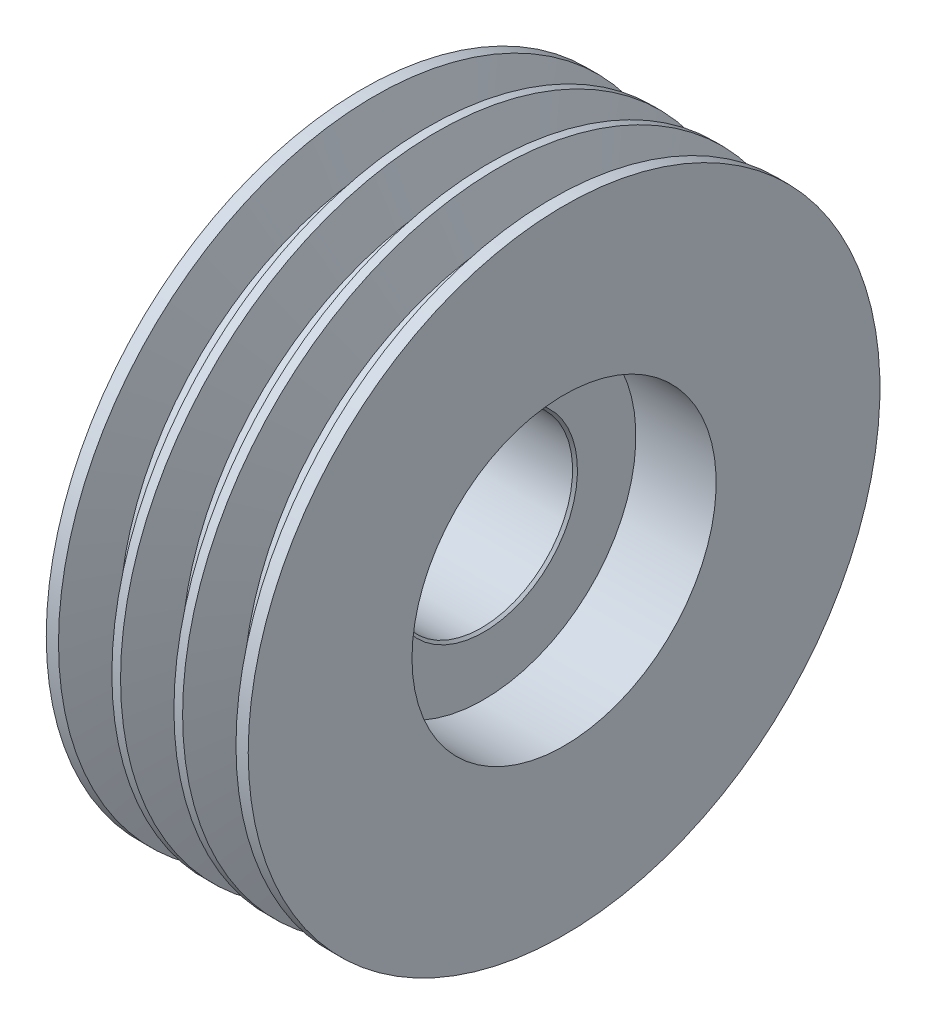
ISO-10303-21;
HEADER;
FILE_DESCRIPTION(('STEP AP214'),'2;1');
FILE_NAME('part.step','',(''),(''),'','','');
FILE_SCHEMA(('AUTOMOTIVE_DESIGN { 1 0 10303 214 1 1 1 1 }'));
ENDSEC;
DATA;
#1=APPLICATION_CONTEXT('core data for automotive mechanical design processes');
#2=APPLICATION_PROTOCOL_DEFINITION('international standard','automotive_design',2000,#1);
#3=PRODUCT_CONTEXT('',#1,'mechanical');
#4=PRODUCT('Part','Part','',(#3));
#5=PRODUCT_RELATED_PRODUCT_CATEGORY('part','',(#4));
#6=PRODUCT_DEFINITION_FORMATION('','',#4);
#7=PRODUCT_DEFINITION_CONTEXT('part definition',#1,'design');
#8=PRODUCT_DEFINITION('design','',#6,#7);
#9=PRODUCT_DEFINITION_SHAPE('','',#8);
#10=(LENGTH_UNIT() NAMED_UNIT(*) SI_UNIT(.MILLI.,.METRE.));
#11=(NAMED_UNIT(*) PLANE_ANGLE_UNIT() SI_UNIT($,.RADIAN.));
#12=(NAMED_UNIT(*) SI_UNIT($,.STERADIAN.) SOLID_ANGLE_UNIT());
#13=UNCERTAINTY_MEASURE_WITH_UNIT(LENGTH_MEASURE(1.E-05),#10,'distance_accuracy_value','');
#14=(GEOMETRIC_REPRESENTATION_CONTEXT(3) GLOBAL_UNCERTAINTY_ASSIGNED_CONTEXT((#13)) GLOBAL_UNIT_ASSIGNED_CONTEXT((#10,
#11,#12)) REPRESENTATION_CONTEXT('',''));
#15=CARTESIAN_POINT('',(0.,0.,0.));
#16=DIRECTION('',(0.,0.,1.));
#17=DIRECTION('',(1.,0.,0.));
#18=AXIS2_PLACEMENT_3D('',#15,#16,#17);
#19=CARTESIAN_POINT('',(0.,0.,0.));
#20=DIRECTION('',(-1.,0.,0.));
#21=DIRECTION('',(0.,0.,1.));
#22=AXIS2_PLACEMENT_3D('',#19,#20,#21);
#23=CYLINDRICAL_SURFACE('',#22,129.8);
#24=CARTESIAN_POINT('',(83.,0.,0.));
#25=DIRECTION('',(-1.,0.,0.));
#26=DIRECTION('',(0.,0.,1.));
#27=AXIS2_PLACEMENT_3D('',#24,#25,#26);
#28=CIRCLE('',#27,129.8);
#29=CARTESIAN_POINT('',(83.,0.,129.8));
#30=VERTEX_POINT('',#29);
#31=EDGE_CURVE('E168',#30,#30,#28,.T.);
#32=ORIENTED_EDGE('',*,*,#31,.T.);
#33=EDGE_LOOP('',(#32));
#34=FACE_BOUND('',#33,.T.);
#35=CARTESIAN_POINT('',(77.9675072710016,0.,0.));
#36=DIRECTION('',(-1.,0.,0.));
#37=DIRECTION('',(0.,0.,1.));
#38=AXIS2_PLACEMENT_3D('',#35,#36,#37);
#39=CIRCLE('',#38,129.8);
#40=CARTESIAN_POINT('',(77.9675072710016,0.,129.8));
#41=VERTEX_POINT('',#40);
#42=EDGE_CURVE('E201',#41,#41,#39,.T.);
#43=ORIENTED_EDGE('',*,*,#42,.F.);
#44=EDGE_LOOP('',(#43));
#45=FACE_BOUND('',#44,.T.);
#46=ADVANCED_FACE('F39',(#34,#45),#23,.T.);
#47=CARTESIAN_POINT('',(52.4675072710015,0.,0.));
#48=DIRECTION('',(-1.,0.,0.));
#49=DIRECTION('',(0.,0.,1.));
#50=AXIS2_PLACEMENT_3D('',#47,#48,#49);
#51=CIRCLE('',#50,129.8);
#52=CARTESIAN_POINT('',(52.4675072710015,0.,129.8));
#53=VERTEX_POINT('',#52);
#54=EDGE_CURVE('E189',#53,#53,#51,.T.);
#55=ORIENTED_EDGE('',*,*,#54,.F.);
#56=EDGE_LOOP('',(#55));
#57=FACE_BOUND('',#56,.T.);
#58=CARTESIAN_POINT('',(56.0324927289984,0.,0.));
#59=DIRECTION('',(-1.,0.,0.));
#60=DIRECTION('',(0.,0.,1.));
#61=AXIS2_PLACEMENT_3D('',#58,#59,#60);
#62=CIRCLE('',#61,129.8);
#63=CARTESIAN_POINT('',(56.0324927289984,0.,129.8));
#64=VERTEX_POINT('',#63);
#65=EDGE_CURVE('E204',#64,#64,#62,.T.);
#66=ORIENTED_EDGE('',*,*,#65,.T.);
#67=EDGE_LOOP('',(#66));
#68=FACE_BOUND('',#67,.T.);
#69=ADVANCED_FACE('F233',(#57,#68),#23,.T.);
#70=CARTESIAN_POINT('',(26.9675072710015,0.,0.));
#71=DIRECTION('',(-1.,0.,0.));
#72=DIRECTION('',(0.,0.,1.));
#73=AXIS2_PLACEMENT_3D('',#70,#71,#72);
#74=CIRCLE('',#73,129.8);
#75=CARTESIAN_POINT('',(26.9675072710015,0.,129.8));
#76=VERTEX_POINT('',#75);
#77=EDGE_CURVE('E177',#76,#76,#74,.T.);
#78=ORIENTED_EDGE('',*,*,#77,.F.);
#79=EDGE_LOOP('',(#78));
#80=FACE_BOUND('',#79,.T.);
#81=CARTESIAN_POINT('',(30.5324927289984,0.,0.));
#82=DIRECTION('',(-1.,0.,0.));
#83=DIRECTION('',(0.,0.,1.));
#84=AXIS2_PLACEMENT_3D('',#81,#82,#83);
#85=CIRCLE('',#84,129.8);
#86=CARTESIAN_POINT('',(30.5324927289984,0.,129.8));
#87=VERTEX_POINT('',#86);
#88=EDGE_CURVE('E192',#87,#87,#85,.T.);
#89=ORIENTED_EDGE('',*,*,#88,.T.);
#90=EDGE_LOOP('',(#89));
#91=FACE_BOUND('',#90,.T.);
#92=ADVANCED_FACE('F241',(#80,#91),#23,.T.);
#93=CARTESIAN_POINT('',(0.,0.,0.));
#94=DIRECTION('',(-1.,0.,0.));
#95=DIRECTION('',(0.,0.,1.));
#96=AXIS2_PLACEMENT_3D('',#93,#94,#95);
#97=CIRCLE('',#96,129.8);
#98=CARTESIAN_POINT('',(0.,0.,129.8));
#99=VERTEX_POINT('',#98);
#100=EDGE_CURVE('E171',#99,#99,#97,.T.);
#101=ORIENTED_EDGE('',*,*,#100,.F.);
#102=EDGE_LOOP('',(#101));
#103=FACE_BOUND('',#102,.T.);
#104=CARTESIAN_POINT('',(5.03249272899844,0.,0.));
#105=DIRECTION('',(-1.,0.,0.));
#106=DIRECTION('',(0.,0.,1.));
#107=AXIS2_PLACEMENT_3D('',#104,#105,#106);
#108=CIRCLE('',#107,129.8);
#109=CARTESIAN_POINT('',(5.03249272899844,0.,129.8));
#110=VERTEX_POINT('',#109);
#111=EDGE_CURVE('E180',#110,#110,#108,.T.);
#112=ORIENTED_EDGE('',*,*,#111,.T.);
#113=EDGE_LOOP('',(#112));
#114=FACE_BOUND('',#113,.T.);
#115=ADVANCED_FACE('F236',(#103,#114),#23,.T.);
#116=CARTESIAN_POINT('',(0.,0.,0.));
#117=DIRECTION('',(-1.,0.,0.));
#118=DIRECTION('',(0.,0.,1.));
#119=AXIS2_PLACEMENT_3D('',#116,#117,#118);
#120=CYLINDRICAL_SURFACE('',#119,37.5);
#121=CARTESIAN_POINT('',(0.999999999999973,0.,0.));
#122=DIRECTION('',(1.,0.,0.));
#123=DIRECTION('',(0.,0.,-1.));
#124=AXIS2_PLACEMENT_3D('',#121,#122,#123);
#125=CIRCLE('',#124,37.5);
#126=CARTESIAN_POINT('',(0.999999999999973,36.1420807370024,-10.));
#127=VERTEX_POINT('',#126);
#128=CARTESIAN_POINT('',(0.999999999999973,36.1420807370024,10.));
#129=VERTEX_POINT('',#128);
#130=EDGE_CURVE('E156',#127,#129,#125,.F.);
#131=ORIENTED_EDGE('',*,*,#130,.T.);
#132=DIRECTION('',(-1.,0.,0.));
#133=VECTOR('',#132,1.);
#134=CARTESIAN_POINT('',(83.,36.1420807370024,10.));
#135=LINE('',#134,#133);
#136=CARTESIAN_POINT('',(49.,36.1420807370024,10.));
#137=VERTEX_POINT('',#136);
#138=EDGE_CURVE('E60',#137,#129,#135,.T.);
#139=ORIENTED_EDGE('',*,*,#138,.F.);
#140=CARTESIAN_POINT('',(49.,0.,0.));
#141=DIRECTION('',(-1.,0.,0.));
#142=DIRECTION('',(0.,0.,1.));
#143=AXIS2_PLACEMENT_3D('',#140,#141,#142);
#144=CIRCLE('',#143,37.5);
#145=CARTESIAN_POINT('',(49.,36.1420807370024,-10.));
#146=VERTEX_POINT('',#145);
#147=EDGE_CURVE('E153',#137,#146,#144,.F.);
#148=ORIENTED_EDGE('',*,*,#147,.T.);
#149=DIRECTION('',(-1.,0.,0.));
#150=VECTOR('',#149,1.);
#151=CARTESIAN_POINT('',(83.,36.1420807370024,-10.));
#152=LINE('',#151,#150);
#153=EDGE_CURVE('E119',#146,#127,#152,.T.);
#154=ORIENTED_EDGE('',*,*,#153,.T.);
#155=EDGE_LOOP('',(#131,#139,#148,#154));
#156=FACE_BOUND('',#155,.T.);
#157=ADVANCED_FACE('F224',(#156),#120,.F.);
#158=CARTESIAN_POINT('',(50.,62.5,0.));
#159=DIRECTION('',(-1.,0.,0.));
#160=DIRECTION('',(0.,0.,1.));
#161=AXIS2_PLACEMENT_3D('',#158,#159,#160);
#162=PLANE('',#161);
#163=DIRECTION('',(0.,0.,-1.));
#164=VECTOR('',#163,1.);
#165=CARTESIAN_POINT('',(50.,42.400000095367,0.));
#166=LINE('',#165,#164);
#167=CARTESIAN_POINT('',(50.,42.400000095367,10.));
#168=VERTEX_POINT('',#167);
#169=CARTESIAN_POINT('',(50.,42.400000095367,-10.));
#170=VERTEX_POINT('',#169);
#171=EDGE_CURVE('E105',#168,#170,#166,.T.);
#172=ORIENTED_EDGE('',*,*,#171,.T.);
#173=DIRECTION('',(0.,-1.,0.));
#174=VECTOR('',#173,1.);
#175=CARTESIAN_POINT('',(50.,62.5,-10.));
#176=LINE('',#175,#174);
#177=CARTESIAN_POINT('',(50.,37.1786228900425,-10.));
#178=VERTEX_POINT('',#177);
#179=EDGE_CURVE('E211',#170,#178,#176,.T.);
#180=ORIENTED_EDGE('',*,*,#179,.T.);
#181=CARTESIAN_POINT('',(50.,0.,0.));
#182=DIRECTION('',(-1.,0.,0.));
#183=DIRECTION('',(0.,0.,1.));
#184=AXIS2_PLACEMENT_3D('',#181,#182,#183);
#185=CIRCLE('',#184,38.4999999999999);
#186=CARTESIAN_POINT('',(50.,37.1786228900425,10.));
#187=VERTEX_POINT('',#186);
#188=EDGE_CURVE('E159',#178,#187,#185,.T.);
#189=ORIENTED_EDGE('',*,*,#188,.T.);
#190=DIRECTION('',(0.,1.,0.));
#191=VECTOR('',#190,1.);
#192=CARTESIAN_POINT('',(50.,62.5,10.));
#193=LINE('',#192,#191);
#194=EDGE_CURVE('E134',#187,#168,#193,.T.);
#195=ORIENTED_EDGE('',*,*,#194,.T.);
#196=EDGE_LOOP('',(#172,#180,#189,#195));
#197=FACE_BOUND('',#196,.T.);
#198=CARTESIAN_POINT('',(50.,0.,0.));
#199=DIRECTION('',(-1.,0.,0.));
#200=DIRECTION('',(0.,0.,1.));
#201=AXIS2_PLACEMENT_3D('',#198,#199,#200);
#202=CIRCLE('',#201,62.5);
#203=CARTESIAN_POINT('',(50.,0.,62.5));
#204=VERTEX_POINT('',#203);
#205=EDGE_CURVE('E162',#204,#204,#202,.T.);
#206=ORIENTED_EDGE('',*,*,#205,.F.);
#207=EDGE_LOOP('',(#206));
#208=FACE_BOUND('',#207,.T.);
#209=ADVANCED_FACE('F217',(#197,#208),#162,.F.);
#210=CARTESIAN_POINT('',(0.,0.,0.));
#211=DIRECTION('',(-1.,0.,0.));
#212=DIRECTION('',(0.,0.,1.));
#213=AXIS2_PLACEMENT_3D('',#210,#211,#212);
#214=CYLINDRICAL_SURFACE('',#213,62.5);
#215=CARTESIAN_POINT('',(83.,0.,0.));
#216=DIRECTION('',(-1.,0.,0.));
#217=DIRECTION('',(0.,0.,1.));
#218=AXIS2_PLACEMENT_3D('',#215,#216,#217);
#219=CIRCLE('',#218,62.5);
#220=CARTESIAN_POINT('',(83.,0.,62.5));
#221=VERTEX_POINT('',#220);
#222=EDGE_CURVE('E165',#221,#221,#219,.T.);
#223=ORIENTED_EDGE('',*,*,#222,.F.);
#224=EDGE_LOOP('',(#223));
#225=FACE_BOUND('',#224,.T.);
#226=ORIENTED_EDGE('',*,*,#205,.T.);
#227=EDGE_LOOP('',(#226));
#228=FACE_BOUND('',#227,.T.);
#229=ADVANCED_FACE('F283',(#225,#228),#214,.F.);
#230=CARTESIAN_POINT('',(83.,129.8,0.));
#231=DIRECTION('',(-1.,0.,0.));
#232=DIRECTION('',(0.,0.,1.));
#233=AXIS2_PLACEMENT_3D('',#230,#231,#232);
#234=PLANE('',#233);
#235=ORIENTED_EDGE('',*,*,#31,.F.);
#236=EDGE_LOOP('',(#235));
#237=FACE_BOUND('',#236,.T.);
#238=ORIENTED_EDGE('',*,*,#222,.T.);
#239=EDGE_LOOP('',(#238));
#240=FACE_BOUND('',#239,.T.);
#241=ADVANCED_FACE('F278',(#237,#240),#234,.F.);
#242=CARTESIAN_POINT('',(0.,37.5,0.));
#243=DIRECTION('',(1.,0.,0.));
#244=DIRECTION('',(0.,0.,-1.));
#245=AXIS2_PLACEMENT_3D('',#242,#243,#244);
#246=PLANE('',#245);
#247=CARTESIAN_POINT('',(0.,0.,0.));
#248=DIRECTION('',(1.,0.,0.));
#249=DIRECTION('',(0.,0.,-1.));
#250=AXIS2_PLACEMENT_3D('',#247,#248,#249);
#251=CIRCLE('',#250,38.5);
#252=CARTESIAN_POINT('',(0.,37.1786228900426,10.));
#253=VERTEX_POINT('',#252);
#254=CARTESIAN_POINT('',(0.,37.1786228900426,-10.));
#255=VERTEX_POINT('',#254);
#256=EDGE_CURVE('E151',#253,#255,#251,.T.);
#257=ORIENTED_EDGE('',*,*,#256,.T.);
#258=DIRECTION('',(0.,-1.,0.));
#259=VECTOR('',#258,1.);
#260=CARTESIAN_POINT('',(0.,36.1420807370024,-10.));
#261=LINE('',#260,#259);
#262=CARTESIAN_POINT('',(0.,42.400000095367,-10.));
#263=VERTEX_POINT('',#262);
#264=EDGE_CURVE('E115',#263,#255,#261,.T.);
#265=ORIENTED_EDGE('',*,*,#264,.F.);
#266=DIRECTION('',(0.,0.,-1.));
#267=VECTOR('',#266,1.);
#268=CARTESIAN_POINT('',(0.,42.400000095367,-10.));
#269=LINE('',#268,#267);
#270=CARTESIAN_POINT('',(0.,42.400000095367,10.));
#271=VERTEX_POINT('',#270);
#272=EDGE_CURVE('E102',#271,#263,#269,.T.);
#273=ORIENTED_EDGE('',*,*,#272,.F.);
#274=DIRECTION('',(0.,1.,0.));
#275=VECTOR('',#274,1.);
#276=CARTESIAN_POINT('',(0.,36.1420807370024,10.));
#277=LINE('',#276,#275);
#278=EDGE_CURVE('E110',#253,#271,#277,.T.);
#279=ORIENTED_EDGE('',*,*,#278,.F.);
#280=EDGE_LOOP('',(#257,#265,#273,#279));
#281=FACE_BOUND('',#280,.T.);
#282=ORIENTED_EDGE('',*,*,#100,.T.);
#283=EDGE_LOOP('',(#282));
#284=FACE_BOUND('',#283,.T.);
#285=ADVANCED_FACE('F117',(#281,#284),#246,.F.);
#286=CARTESIAN_POINT('',(0.,0.,0.));
#287=DIRECTION('',(-1.,0.,0.));
#288=DIRECTION('',(0.,0.,1.));
#289=AXIS2_PLACEMENT_3D('',#286,#287,#288);
#290=CYLINDRICAL_SURFACE('',#289,110.7);
#291=CARTESIAN_POINT('',(21.1280512551412,0.,0.));
#292=DIRECTION('',(-1.,0.,0.));
#293=DIRECTION('',(0.,0.,1.));
#294=AXIS2_PLACEMENT_3D('',#291,#292,#293);
#295=CIRCLE('',#294,110.7);
#296=CARTESIAN_POINT('',(21.1280512551412,0.,110.7));
#297=VERTEX_POINT('',#296);
#298=EDGE_CURVE('E174',#297,#297,#295,.T.);
#299=ORIENTED_EDGE('',*,*,#298,.T.);
#300=EDGE_LOOP('',(#299));
#301=FACE_BOUND('',#300,.T.);
#302=CARTESIAN_POINT('',(10.8719487448588,0.,0.));
#303=DIRECTION('',(-1.,0.,0.));
#304=DIRECTION('',(0.,0.,1.));
#305=AXIS2_PLACEMENT_3D('',#302,#303,#304);
#306=CIRCLE('',#305,110.7);
#307=CARTESIAN_POINT('',(10.8719487448588,0.,110.7));
#308=VERTEX_POINT('',#307);
#309=EDGE_CURVE('E183',#308,#308,#306,.T.);
#310=ORIENTED_EDGE('',*,*,#309,.F.);
#311=EDGE_LOOP('',(#310));
#312=FACE_BOUND('',#311,.T.);
#313=ADVANCED_FACE('F271',(#301,#312),#290,.T.);
#314=CARTESIAN_POINT('',(21.1280512551412,0.,0.));
#315=DIRECTION('',(1.,0.,0.));
#316=DIRECTION('',(0.,0.,-1.));
#317=AXIS2_PLACEMENT_3D('',#314,#315,#316);
#318=CONICAL_SURFACE('',#317,110.7,1.27409035395586);
#319=ORIENTED_EDGE('',*,*,#77,.T.);
#320=EDGE_LOOP('',(#319));
#321=FACE_BOUND('',#320,.T.);
#322=ORIENTED_EDGE('',*,*,#298,.F.);
#323=EDGE_LOOP('',(#322));
#324=FACE_BOUND('',#323,.T.);
#325=ADVANCED_FACE('F261',(#321,#324),#318,.T.);
#326=CARTESIAN_POINT('',(5.03249272899844,0.,0.));
#327=DIRECTION('',(-1.,0.,0.));
#328=DIRECTION('',(0.,0.,1.));
#329=AXIS2_PLACEMENT_3D('',#326,#327,#328);
#330=CONICAL_SURFACE('',#329,129.8,1.27409035395586);
#331=ORIENTED_EDGE('',*,*,#309,.T.);
#332=EDGE_LOOP('',(#331));
#333=FACE_BOUND('',#332,.T.);
#334=ORIENTED_EDGE('',*,*,#111,.F.);
#335=EDGE_LOOP('',(#334));
#336=FACE_BOUND('',#335,.T.);
#337=ADVANCED_FACE('F259',(#333,#336),#330,.T.);
#338=CARTESIAN_POINT('',(25.5,0.,0.));
#339=DIRECTION('',(-1.,0.,0.));
#340=DIRECTION('',(0.,0.,1.));
#341=AXIS2_PLACEMENT_3D('',#338,#339,#340);
#342=CYLINDRICAL_SURFACE('',#341,110.7);
#343=CARTESIAN_POINT('',(46.6280512551412,0.,0.));
#344=DIRECTION('',(-1.,0.,0.));
#345=DIRECTION('',(0.,0.,1.));
#346=AXIS2_PLACEMENT_3D('',#343,#344,#345);
#347=CIRCLE('',#346,110.7);
#348=CARTESIAN_POINT('',(46.6280512551412,0.,110.7));
#349=VERTEX_POINT('',#348);
#350=EDGE_CURVE('E186',#349,#349,#347,.T.);
#351=ORIENTED_EDGE('',*,*,#350,.T.);
#352=EDGE_LOOP('',(#351));
#353=FACE_BOUND('',#352,.T.);
#354=CARTESIAN_POINT('',(36.3719487448588,0.,0.));
#355=DIRECTION('',(-1.,0.,0.));
#356=DIRECTION('',(0.,0.,1.));
#357=AXIS2_PLACEMENT_3D('',#354,#355,#356);
#358=CIRCLE('',#357,110.7);
#359=CARTESIAN_POINT('',(36.3719487448588,0.,110.7));
#360=VERTEX_POINT('',#359);
#361=EDGE_CURVE('E195',#360,#360,#358,.T.);
#362=ORIENTED_EDGE('',*,*,#361,.F.);
#363=EDGE_LOOP('',(#362));
#364=FACE_BOUND('',#363,.T.);
#365=ADVANCED_FACE('F260',(#353,#364),#342,.T.);
#366=CARTESIAN_POINT('',(46.6280512551412,0.,0.));
#367=DIRECTION('',(1.,0.,0.));
#368=DIRECTION('',(0.,0.,-1.));
#369=AXIS2_PLACEMENT_3D('',#366,#367,#368);
#370=CONICAL_SURFACE('',#369,110.7,1.27409035395586);
#371=ORIENTED_EDGE('',*,*,#54,.T.);
#372=EDGE_LOOP('',(#371));
#373=FACE_BOUND('',#372,.T.);
#374=ORIENTED_EDGE('',*,*,#350,.F.);
#375=EDGE_LOOP('',(#374));
#376=FACE_BOUND('',#375,.T.);
#377=ADVANCED_FACE('F268',(#373,#376),#370,.T.);
#378=CARTESIAN_POINT('',(30.5324927289984,0.,0.));
#379=DIRECTION('',(-1.,0.,0.));
#380=DIRECTION('',(0.,0.,1.));
#381=AXIS2_PLACEMENT_3D('',#378,#379,#380);
#382=CONICAL_SURFACE('',#381,129.8,1.27409035395586);
#383=ORIENTED_EDGE('',*,*,#361,.T.);
#384=EDGE_LOOP('',(#383));
#385=FACE_BOUND('',#384,.T.);
#386=ORIENTED_EDGE('',*,*,#88,.F.);
#387=EDGE_LOOP('',(#386));
#388=FACE_BOUND('',#387,.T.);
#389=ADVANCED_FACE('F327',(#385,#388),#382,.T.);
#390=CARTESIAN_POINT('',(51.,0.,0.));
#391=DIRECTION('',(-1.,0.,0.));
#392=DIRECTION('',(0.,0.,1.));
#393=AXIS2_PLACEMENT_3D('',#390,#391,#392);
#394=CYLINDRICAL_SURFACE('',#393,110.7);
#395=CARTESIAN_POINT('',(72.1280512551412,0.,0.));
#396=DIRECTION('',(-1.,0.,0.));
#397=DIRECTION('',(0.,0.,1.));
#398=AXIS2_PLACEMENT_3D('',#395,#396,#397);
#399=CIRCLE('',#398,110.7);
#400=CARTESIAN_POINT('',(72.1280512551412,0.,110.7));
#401=VERTEX_POINT('',#400);
#402=EDGE_CURVE('E198',#401,#401,#399,.T.);
#403=ORIENTED_EDGE('',*,*,#402,.T.);
#404=EDGE_LOOP('',(#403));
#405=FACE_BOUND('',#404,.T.);
#406=CARTESIAN_POINT('',(61.8719487448588,0.,0.));
#407=DIRECTION('',(-1.,0.,0.));
#408=DIRECTION('',(0.,0.,1.));
#409=AXIS2_PLACEMENT_3D('',#406,#407,#408);
#410=CIRCLE('',#409,110.7);
#411=CARTESIAN_POINT('',(61.8719487448588,0.,110.7));
#412=VERTEX_POINT('',#411);
#413=EDGE_CURVE('E207',#412,#412,#410,.T.);
#414=ORIENTED_EDGE('',*,*,#413,.F.);
#415=EDGE_LOOP('',(#414));
#416=FACE_BOUND('',#415,.T.);
#417=ADVANCED_FACE('F318',(#405,#416),#394,.T.);
#418=CARTESIAN_POINT('',(72.1280512551412,0.,0.));
#419=DIRECTION('',(1.,0.,0.));
#420=DIRECTION('',(0.,0.,-1.));
#421=AXIS2_PLACEMENT_3D('',#418,#419,#420);
#422=CONICAL_SURFACE('',#421,110.7,1.27409035395586);
#423=ORIENTED_EDGE('',*,*,#42,.T.);
#424=EDGE_LOOP('',(#423));
#425=FACE_BOUND('',#424,.T.);
#426=ORIENTED_EDGE('',*,*,#402,.F.);
#427=EDGE_LOOP('',(#426));
#428=FACE_BOUND('',#427,.T.);
#429=ADVANCED_FACE('F309',(#425,#428),#422,.T.);
#430=CARTESIAN_POINT('',(56.0324927289984,0.,0.));
#431=DIRECTION('',(-1.,0.,0.));
#432=DIRECTION('',(0.,0.,1.));
#433=AXIS2_PLACEMENT_3D('',#430,#431,#432);
#434=CONICAL_SURFACE('',#433,129.8,1.27409035395586);
#435=ORIENTED_EDGE('',*,*,#413,.T.);
#436=EDGE_LOOP('',(#435));
#437=FACE_BOUND('',#436,.T.);
#438=ORIENTED_EDGE('',*,*,#65,.F.);
#439=EDGE_LOOP('',(#438));
#440=FACE_BOUND('',#439,.T.);
#441=ADVANCED_FACE('F305',(#437,#440),#434,.T.);
#442=CARTESIAN_POINT('',(50.,0.,0.));
#443=DIRECTION('',(1.,0.,0.));
#444=DIRECTION('',(0.,0.,-1.));
#445=AXIS2_PLACEMENT_3D('',#442,#443,#444);
#446=CONICAL_SURFACE('',#445,38.4999999999999,0.785398163397431);
#447=CARTESIAN_POINT('',(45.712114205704,32.7180188645972,-10.));
#448=CARTESIAN_POINT('',(46.3033714352215,33.3362622668781,-10.));
#449=CARTESIAN_POINT('',(46.8953617880307,33.9538037229433,-10.));
#450=CARTESIAN_POINT('',(48.0806180544903,35.1876576031533,-10.));
#451=CARTESIAN_POINT('',(48.6738839640105,35.8039700312653,-10.));
#452=CARTESIAN_POINT('',(49.8615039702984,37.0355441789941,-10.));
#453=CARTESIAN_POINT('',(50.4558580661247,37.650805899519,-10.));
#454=CARTESIAN_POINT('',(51.6455169665124,38.8804134300182,-10.));
#455=CARTESIAN_POINT('',(52.240821774136,39.4947592370298,-10.));
#456=CARTESIAN_POINT('',(52.8365310236076,40.1087122339481,-10.));
#457=B_SPLINE_CURVE_WITH_KNOTS('',3,(#447,#448,#449,#450,#451,#452,#453,#454,#455,#456),
.UNSPECIFIED.,.F.,.F.,(4,2,2,2,4),(0.,2.56637539407019,5.13274249075186,7.69910736816067,
10.2654805286465),.UNSPECIFIED.);
#458=EDGE_CURVE('E68',#146,#178,#457,.T.);
#459=ORIENTED_EDGE('',*,*,#458,.F.);
#460=ORIENTED_EDGE('',*,*,#147,.F.);
#461=CARTESIAN_POINT('',(52.8365310236076,40.1087122339481,10.));
#462=CARTESIAN_POINT('',(52.240821774136,39.4947592370298,10.));
#463=CARTESIAN_POINT('',(51.6455169665124,38.8804134300182,10.));
#464=CARTESIAN_POINT('',(50.4558580661247,37.650805899519,10.));
#465=CARTESIAN_POINT('',(49.8615039702984,37.0355441789941,10.));
#466=CARTESIAN_POINT('',(48.6738839640105,35.8039700312653,10.));
#467=CARTESIAN_POINT('',(48.0806180544903,35.1876576031533,10.));
#468=CARTESIAN_POINT('',(46.8953617880307,33.9538037229433,10.));
#469=CARTESIAN_POINT('',(46.3033714352215,33.3362622668781,10.));
#470=CARTESIAN_POINT('',(45.712114205704,32.7180188645972,10.));
#471=B_SPLINE_CURVE_WITH_KNOTS('',3,(#461,#462,#463,#464,#465,#466,#467,#468,#469,#470),
.UNSPECIFIED.,.F.,.F.,(4,2,2,2,4),(0.,2.56637316048581,5.13273803789463,7.69910513457629,
10.2654805286465),.UNSPECIFIED.);
#472=EDGE_CURVE('E125',#187,#137,#471,.T.);
#473=ORIENTED_EDGE('',*,*,#472,.F.);
#474=ORIENTED_EDGE('',*,*,#188,.F.);
#475=EDGE_LOOP('',(#459,#460,#473,#474));
#476=FACE_BOUND('',#475,.T.);
#477=ADVANCED_FACE('F136',(#476),#446,.F.);
#478=CARTESIAN_POINT('',(0.999999999999973,0.,0.));
#479=DIRECTION('',(-1.,0.,0.));
#480=DIRECTION('',(0.,0.,1.));
#481=AXIS2_PLACEMENT_3D('',#478,#479,#480);
#482=CONICAL_SURFACE('',#481,37.5,0.785398163397455);
#483=CARTESIAN_POINT('',(-3.07824738213561,40.3577830829453,-10.));
#484=CARTESIAN_POINT('',(-2.48242757311099,39.7439375219364,-10.));
#485=CARTESIAN_POINT('',(-1.8870050163604,39.1297060040633,-10.));
#486=CARTESIAN_POINT('',(-0.697092612853653,37.9003439470265,-10.));
#487=CARTESIAN_POINT('',(-0.102602763210375,37.2852134106571,-10.));
#488=CARTESIAN_POINT('',(1.08531020862037,36.0539218946503,-10.));
#489=CARTESIAN_POINT('',(1.67873332992676,35.4377609141626,-10.));
#490=CARTESIAN_POINT('',(2.86433059267829,34.2042349341738,-10.));
#491=CARTESIAN_POINT('',(3.45650473023736,33.5868699309378,-10.));
#492=CARTESIAN_POINT('',(4.04796165127179,32.9688177886656,-10.));
#493=B_SPLINE_CURVE_WITH_KNOTS('',3,(#483,#484,#485,#486,#487,#488,#489,#490,#491,#492),
.UNSPECIFIED.,.F.,.F.,(4,2,2,2,4),(0.,2.56637284396586,5.1327377281954,7.69910473118096,
10.2654797073896),.UNSPECIFIED.);
#494=EDGE_CURVE('E11',#255,#127,#493,.T.);
#495=ORIENTED_EDGE('',*,*,#494,.F.);
#496=ORIENTED_EDGE('',*,*,#256,.F.);
#497=CARTESIAN_POINT('',(4.04796165127179,32.9688177886656,10.));
#498=CARTESIAN_POINT('',(3.45650473023736,33.5868699309378,10.));
#499=CARTESIAN_POINT('',(2.86433059267829,34.2042349341738,10.));
#500=CARTESIAN_POINT('',(1.67873332992675,35.4377609141626,10.));
#501=CARTESIAN_POINT('',(1.08531020862037,36.0539218946503,10.));
#502=CARTESIAN_POINT('',(-0.10260276321038,37.2852134106571,10.));
#503=CARTESIAN_POINT('',(-0.697092612853656,37.9003439470265,10.));
#504=CARTESIAN_POINT('',(-1.8870050163604,39.1297060040633,10.));
#505=CARTESIAN_POINT('',(-2.48242757311099,39.7439375219364,10.));
#506=CARTESIAN_POINT('',(-3.07824738213561,40.3577830829453,10.));
#507=B_SPLINE_CURVE_WITH_KNOTS('',3,(#497,#498,#499,#500,#501,#502,#503,#504,#505,#506),
.UNSPECIFIED.,.F.,.F.,(4,2,2,2,4),(0.,2.56637497620862,5.13274197919418,7.69910686342372,
10.2654797073896),.UNSPECIFIED.);
#508=EDGE_CURVE('E53',#129,#253,#507,.T.);
#509=ORIENTED_EDGE('',*,*,#508,.F.);
#510=ORIENTED_EDGE('',*,*,#130,.F.);
#511=EDGE_LOOP('',(#495,#496,#509,#510));
#512=FACE_BOUND('',#511,.T.);
#513=ADVANCED_FACE('F41',(#512),#482,.F.);
#514=CARTESIAN_POINT('',(83.,42.400000095367,-10.));
#515=DIRECTION('',(0.,1.,0.));
#516=DIRECTION('',(0.,0.,1.));
#517=AXIS2_PLACEMENT_3D('',#514,#515,#516);
#518=PLANE('',#517);
#519=DIRECTION('',(-1.,0.,0.));
#520=VECTOR('',#519,1.);
#521=CARTESIAN_POINT('',(83.,42.400000095367,10.));
#522=LINE('',#521,#520);
#523=EDGE_CURVE('E97',#168,#271,#522,.T.);
#524=ORIENTED_EDGE('',*,*,#523,.T.);
#525=ORIENTED_EDGE('',*,*,#272,.T.);
#526=DIRECTION('',(-1.,0.,0.));
#527=VECTOR('',#526,1.);
#528=CARTESIAN_POINT('',(83.,42.400000095367,-10.));
#529=LINE('',#528,#527);
#530=EDGE_CURVE('E107',#170,#263,#529,.T.);
#531=ORIENTED_EDGE('',*,*,#530,.F.);
#532=ORIENTED_EDGE('',*,*,#171,.F.);
#533=EDGE_LOOP('',(#524,#525,#531,#532));
#534=FACE_BOUND('',#533,.T.);
#535=ADVANCED_FACE('F99',(#534),#518,.F.);
#536=CARTESIAN_POINT('',(83.,36.1420807370024,-10.));
#537=DIRECTION('',(0.,0.,-1.));
#538=DIRECTION('',(-1.,0.,0.));
#539=AXIS2_PLACEMENT_3D('',#536,#537,#538);
#540=PLANE('',#539);
#541=ORIENTED_EDGE('',*,*,#530,.T.);
#542=ORIENTED_EDGE('',*,*,#264,.T.);
#543=ORIENTED_EDGE('',*,*,#494,.T.);
#544=ORIENTED_EDGE('',*,*,#153,.F.);
#545=ORIENTED_EDGE('',*,*,#458,.T.);
#546=ORIENTED_EDGE('',*,*,#179,.F.);
#547=EDGE_LOOP('',(#541,#542,#543,#544,#545,#546));
#548=FACE_BOUND('',#547,.T.);
#549=ADVANCED_FACE('F142',(#548),#540,.F.);
#550=CARTESIAN_POINT('',(83.,36.1420807370024,10.));
#551=DIRECTION('',(0.,0.,1.));
#552=DIRECTION('',(1.,0.,0.));
#553=AXIS2_PLACEMENT_3D('',#550,#551,#552);
#554=PLANE('',#553);
#555=ORIENTED_EDGE('',*,*,#472,.T.);
#556=ORIENTED_EDGE('',*,*,#138,.T.);
#557=ORIENTED_EDGE('',*,*,#508,.T.);
#558=ORIENTED_EDGE('',*,*,#278,.T.);
#559=ORIENTED_EDGE('',*,*,#523,.F.);
#560=ORIENTED_EDGE('',*,*,#194,.F.);
#561=EDGE_LOOP('',(#555,#556,#557,#558,#559,#560));
#562=FACE_BOUND('',#561,.T.);
#563=ADVANCED_FACE('F111',(#562),#554,.F.);
#564=CLOSED_SHELL('',(#46,#69,#92,#115,#157,#209,#229,#241,#285,#313,#325,#337,#365,#377,#389,
#417,#429,#441,#477,#513,#535,#549,#563));
#565=MANIFOLD_SOLID_BREP('B2',#564);
#566=ADVANCED_BREP_SHAPE_REPRESENTATION('',(#18,#565),#14);
#567=SHAPE_DEFINITION_REPRESENTATION(#9,#566);
ENDSEC;
END-ISO-10303-21;
